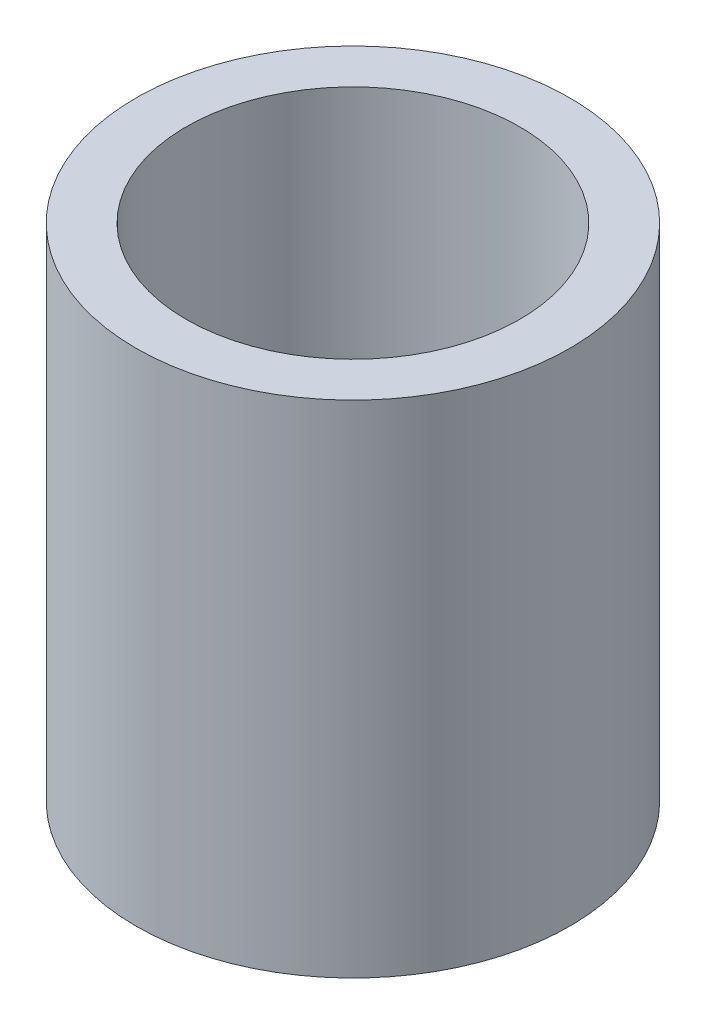
ISO-10303-21;
HEADER;
FILE_DESCRIPTION(('STEP AP214'),'2;1');
FILE_NAME('part.step','',(''),(''),'','','');
FILE_SCHEMA(('AUTOMOTIVE_DESIGN { 1 0 10303 214 1 1 1 1 }'));
ENDSEC;
DATA;
#1=APPLICATION_CONTEXT('core data for automotive mechanical design processes');
#2=APPLICATION_PROTOCOL_DEFINITION('international standard','automotive_design',2000,#1);
#3=PRODUCT_CONTEXT('',#1,'mechanical');
#4=PRODUCT('Part','Part','',(#3));
#5=PRODUCT_RELATED_PRODUCT_CATEGORY('part','',(#4));
#6=PRODUCT_DEFINITION_FORMATION('','',#4);
#7=PRODUCT_DEFINITION_CONTEXT('part definition',#1,'design');
#8=PRODUCT_DEFINITION('design','',#6,#7);
#9=PRODUCT_DEFINITION_SHAPE('','',#8);
#10=(LENGTH_UNIT() NAMED_UNIT(*) SI_UNIT(.MILLI.,.METRE.));
#11=(NAMED_UNIT(*) PLANE_ANGLE_UNIT() SI_UNIT($,.RADIAN.));
#12=(NAMED_UNIT(*) SI_UNIT($,.STERADIAN.) SOLID_ANGLE_UNIT());
#13=UNCERTAINTY_MEASURE_WITH_UNIT(LENGTH_MEASURE(1.E-05),#10,'distance_accuracy_value','');
#14=(GEOMETRIC_REPRESENTATION_CONTEXT(3) GLOBAL_UNCERTAINTY_ASSIGNED_CONTEXT((#13)) GLOBAL_UNIT_ASSIGNED_CONTEXT((#10,
#11,#12)) REPRESENTATION_CONTEXT('',''));
#15=CARTESIAN_POINT('',(0.,0.,0.));
#16=DIRECTION('',(0.,0.,1.));
#17=DIRECTION('',(1.,0.,0.));
#18=AXIS2_PLACEMENT_3D('',#15,#16,#17);
#19=CARTESIAN_POINT('',(0.,6.,0.));
#20=DIRECTION('',(0.,1.,0.));
#21=DIRECTION('',(0.,0.,1.));
#22=AXIS2_PLACEMENT_3D('',#19,#20,#21);
#23=PLANE('',#22);
#24=CARTESIAN_POINT('',(0.,6.,0.));
#25=DIRECTION('',(0.,1.,0.));
#26=DIRECTION('',(0.,0.,1.));
#27=AXIS2_PLACEMENT_3D('',#24,#25,#26);
#28=CIRCLE('',#27,2.6);
#29=CARTESIAN_POINT('',(0.,6.,2.6));
#30=VERTEX_POINT('',#29);
#31=EDGE_CURVE('E10',#30,#30,#28,.T.);
#32=ORIENTED_EDGE('',*,*,#31,.T.);
#33=EDGE_LOOP('',(#32));
#34=FACE_BOUND('',#33,.T.);
#35=CARTESIAN_POINT('',(0.,6.,0.));
#36=DIRECTION('',(0.,1.,0.));
#37=DIRECTION('',(0.,0.,1.));
#38=AXIS2_PLACEMENT_3D('',#35,#36,#37);
#39=CIRCLE('',#38,2.);
#40=CARTESIAN_POINT('',(0.,6.,2.));
#41=VERTEX_POINT('',#40);
#42=EDGE_CURVE('E42',#41,#41,#39,.T.);
#43=ORIENTED_EDGE('',*,*,#42,.F.);
#44=EDGE_LOOP('',(#43));
#45=FACE_BOUND('',#44,.T.);
#46=ADVANCED_FACE('F31',(#34,#45),#23,.T.);
#47=CARTESIAN_POINT('',(0.,0.,0.));
#48=DIRECTION('',(0.,1.,0.));
#49=DIRECTION('',(0.,0.,1.));
#50=AXIS2_PLACEMENT_3D('',#47,#48,#49);
#51=PLANE('',#50);
#52=CARTESIAN_POINT('',(0.,0.,0.));
#53=DIRECTION('',(0.,1.,0.));
#54=DIRECTION('',(0.,0.,1.));
#55=AXIS2_PLACEMENT_3D('',#52,#53,#54);
#56=CIRCLE('',#55,2.6);
#57=CARTESIAN_POINT('',(0.,0.,2.6));
#58=VERTEX_POINT('',#57);
#59=EDGE_CURVE('E35',#58,#58,#56,.T.);
#60=ORIENTED_EDGE('',*,*,#59,.F.);
#61=EDGE_LOOP('',(#60));
#62=FACE_BOUND('',#61,.T.);
#63=CARTESIAN_POINT('',(0.,0.,0.));
#64=DIRECTION('',(0.,1.,0.));
#65=DIRECTION('',(0.,0.,1.));
#66=AXIS2_PLACEMENT_3D('',#63,#64,#65);
#67=CIRCLE('',#66,2.);
#68=CARTESIAN_POINT('',(0.,0.,2.));
#69=VERTEX_POINT('',#68);
#70=EDGE_CURVE('E44',#69,#69,#67,.T.);
#71=ORIENTED_EDGE('',*,*,#70,.T.);
#72=EDGE_LOOP('',(#71));
#73=FACE_BOUND('',#72,.T.);
#74=ADVANCED_FACE('F54',(#62,#73),#51,.F.);
#75=CARTESIAN_POINT('',(0.,6.,0.));
#76=DIRECTION('',(0.,-1.,0.));
#77=DIRECTION('',(0.,0.,-1.));
#78=AXIS2_PLACEMENT_3D('',#75,#76,#77);
#79=CYLINDRICAL_SURFACE('',#78,2.6);
#80=ORIENTED_EDGE('',*,*,#31,.F.);
#81=EDGE_LOOP('',(#80));
#82=FACE_BOUND('',#81,.T.);
#83=ORIENTED_EDGE('',*,*,#59,.T.);
#84=EDGE_LOOP('',(#83));
#85=FACE_BOUND('',#84,.T.);
#86=ADVANCED_FACE('F33',(#82,#85),#79,.T.);
#87=CARTESIAN_POINT('',(0.,6.,0.));
#88=DIRECTION('',(0.,-1.,0.));
#89=DIRECTION('',(0.,0.,-1.));
#90=AXIS2_PLACEMENT_3D('',#87,#88,#89);
#91=CYLINDRICAL_SURFACE('',#90,2.);
#92=ORIENTED_EDGE('',*,*,#42,.T.);
#93=EDGE_LOOP('',(#92));
#94=FACE_BOUND('',#93,.T.);
#95=ORIENTED_EDGE('',*,*,#70,.F.);
#96=EDGE_LOOP('',(#95));
#97=FACE_BOUND('',#96,.T.);
#98=ADVANCED_FACE('F50',(#94,#97),#91,.F.);
#99=CLOSED_SHELL('',(#46,#74,#86,#98));
#100=MANIFOLD_SOLID_BREP('B2',#99);
#101=ADVANCED_BREP_SHAPE_REPRESENTATION('',(#18,#100),#14);
#102=SHAPE_DEFINITION_REPRESENTATION(#9,#101);
ENDSEC;
END-ISO-10303-21;
